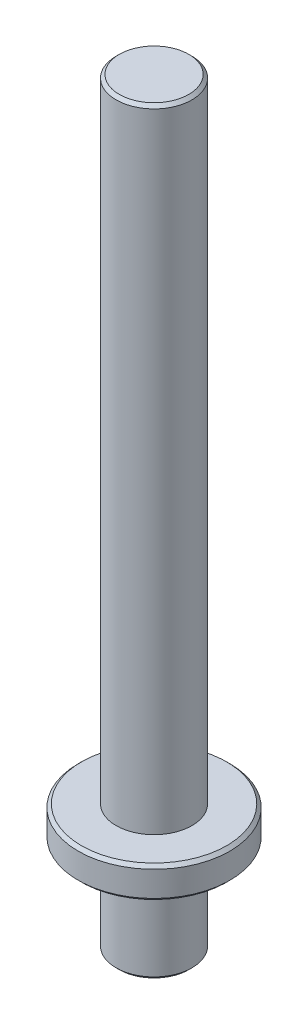
ISO-10303-21;
HEADER;
FILE_DESCRIPTION(('STEP AP214'),'2;1');
FILE_NAME('part.step','',(''),(''),'','','');
FILE_SCHEMA(('AUTOMOTIVE_DESIGN { 1 0 10303 214 1 1 1 1 }'));
ENDSEC;
DATA;
#1=APPLICATION_CONTEXT('core data for automotive mechanical design processes');
#2=APPLICATION_PROTOCOL_DEFINITION('international standard','automotive_design',2000,#1);
#3=PRODUCT_CONTEXT('',#1,'mechanical');
#4=PRODUCT('Part','Part','',(#3));
#5=PRODUCT_RELATED_PRODUCT_CATEGORY('part','',(#4));
#6=PRODUCT_DEFINITION_FORMATION('','',#4);
#7=PRODUCT_DEFINITION_CONTEXT('part definition',#1,'design');
#8=PRODUCT_DEFINITION('design','',#6,#7);
#9=PRODUCT_DEFINITION_SHAPE('','',#8);
#10=(LENGTH_UNIT() NAMED_UNIT(*) SI_UNIT(.MILLI.,.METRE.));
#11=(NAMED_UNIT(*) PLANE_ANGLE_UNIT() SI_UNIT($,.RADIAN.));
#12=(NAMED_UNIT(*) SI_UNIT($,.STERADIAN.) SOLID_ANGLE_UNIT());
#13=UNCERTAINTY_MEASURE_WITH_UNIT(LENGTH_MEASURE(1.E-05),#10,'distance_accuracy_value','');
#14=(GEOMETRIC_REPRESENTATION_CONTEXT(3) GLOBAL_UNCERTAINTY_ASSIGNED_CONTEXT((#13)) GLOBAL_UNIT_ASSIGNED_CONTEXT((#10,
#11,#12)) REPRESENTATION_CONTEXT('',''));
#15=CARTESIAN_POINT('',(0.,0.,0.));
#16=DIRECTION('',(0.,0.,1.));
#17=DIRECTION('',(1.,0.,0.));
#18=AXIS2_PLACEMENT_3D('',#15,#16,#17);
#19=CARTESIAN_POINT('',(0.,120.,0.));
#20=DIRECTION('',(0.,-1.,0.));
#21=DIRECTION('',(0.,0.,-1.));
#22=AXIS2_PLACEMENT_3D('',#19,#20,#21);
#23=CYLINDRICAL_SURFACE('',#22,6.);
#24=CARTESIAN_POINT('',(0.,119.5,0.));
#25=DIRECTION('',(0.,1.,0.));
#26=DIRECTION('',(0.,0.,1.));
#27=AXIS2_PLACEMENT_3D('',#24,#25,#26);
#28=CIRCLE('',#27,6.);
#29=CARTESIAN_POINT('',(0.,119.5,6.));
#30=VERTEX_POINT('',#29);
#31=EDGE_CURVE('E10',#30,#30,#28,.F.);
#32=ORIENTED_EDGE('',*,*,#31,.T.);
#33=EDGE_LOOP('',(#32));
#34=FACE_BOUND('',#33,.T.);
#35=CARTESIAN_POINT('',(0.,20.,0.));
#36=DIRECTION('',(0.,1.,0.));
#37=DIRECTION('',(0.,0.,1.));
#38=AXIS2_PLACEMENT_3D('',#35,#36,#37);
#39=CIRCLE('',#38,6.);
#40=CARTESIAN_POINT('',(0.,20.,6.));
#41=VERTEX_POINT('',#40);
#42=EDGE_CURVE('E72',#41,#41,#39,.T.);
#43=ORIENTED_EDGE('',*,*,#42,.T.);
#44=EDGE_LOOP('',(#43));
#45=FACE_BOUND('',#44,.T.);
#46=ADVANCED_FACE('F39',(#34,#45),#23,.T.);
#47=CARTESIAN_POINT('',(0.,120.,0.));
#48=DIRECTION('',(0.,1.,0.));
#49=DIRECTION('',(0.,0.,1.));
#50=AXIS2_PLACEMENT_3D('',#47,#48,#49);
#51=PLANE('',#50);
#52=CARTESIAN_POINT('',(0.,120.,0.));
#53=DIRECTION('',(0.,1.,0.));
#54=DIRECTION('',(0.,0.,1.));
#55=AXIS2_PLACEMENT_3D('',#52,#53,#54);
#56=CIRCLE('',#55,5.50000000000002);
#57=CARTESIAN_POINT('',(0.,120.,5.50000000000002));
#58=VERTEX_POINT('',#57);
#59=EDGE_CURVE('E47',#58,#58,#56,.T.);
#60=ORIENTED_EDGE('',*,*,#59,.T.);
#61=EDGE_LOOP('',(#60));
#62=FACE_BOUND('',#61,.T.);
#63=ADVANCED_FACE('F97',(#62),#51,.T.);
#64=CARTESIAN_POINT('',(0.,20.,0.));
#65=DIRECTION('',(0.,1.,0.));
#66=DIRECTION('',(0.,0.,1.));
#67=AXIS2_PLACEMENT_3D('',#64,#65,#66);
#68=PLANE('',#67);
#69=CARTESIAN_POINT('',(0.,20.,0.));
#70=DIRECTION('',(0.,1.,0.));
#71=DIRECTION('',(0.,0.,1.));
#72=AXIS2_PLACEMENT_3D('',#69,#70,#71);
#73=CIRCLE('',#72,11.5);
#74=CARTESIAN_POINT('',(0.,20.,11.5));
#75=VERTEX_POINT('',#74);
#76=EDGE_CURVE('E51',#75,#75,#73,.T.);
#77=ORIENTED_EDGE('',*,*,#76,.T.);
#78=EDGE_LOOP('',(#77));
#79=FACE_BOUND('',#78,.T.);
#80=ORIENTED_EDGE('',*,*,#42,.F.);
#81=EDGE_LOOP('',(#80));
#82=FACE_BOUND('',#81,.T.);
#83=ADVANCED_FACE('F93',(#79,#82),#68,.T.);
#84=CARTESIAN_POINT('',(0.,0.,0.));
#85=DIRECTION('',(0.,-1.,0.));
#86=DIRECTION('',(0.,0.,-1.));
#87=AXIS2_PLACEMENT_3D('',#84,#85,#86);
#88=CYLINDRICAL_SURFACE('',#87,12.);
#89=CARTESIAN_POINT('',(0.,15.5,0.));
#90=DIRECTION('',(0.,-1.,0.));
#91=DIRECTION('',(0.,0.,-1.));
#92=AXIS2_PLACEMENT_3D('',#89,#90,#91);
#93=CIRCLE('',#92,12.);
#94=CARTESIAN_POINT('',(0.,15.5,-12.));
#95=VERTEX_POINT('',#94);
#96=EDGE_CURVE('E55',#95,#95,#93,.F.);
#97=ORIENTED_EDGE('',*,*,#96,.T.);
#98=EDGE_LOOP('',(#97));
#99=FACE_BOUND('',#98,.T.);
#100=CARTESIAN_POINT('',(0.,19.5,0.));
#101=DIRECTION('',(0.,1.,0.));
#102=DIRECTION('',(0.,0.,1.));
#103=AXIS2_PLACEMENT_3D('',#100,#101,#102);
#104=CIRCLE('',#103,12.);
#105=CARTESIAN_POINT('',(0.,19.5,12.));
#106=VERTEX_POINT('',#105);
#107=EDGE_CURVE('E60',#106,#106,#104,.F.);
#108=ORIENTED_EDGE('',*,*,#107,.T.);
#109=EDGE_LOOP('',(#108));
#110=FACE_BOUND('',#109,.T.);
#111=ADVANCED_FACE('F84',(#99,#110),#88,.T.);
#112=CARTESIAN_POINT('',(0.,15.,-12.));
#113=DIRECTION('',(0.,-1.,0.));
#114=DIRECTION('',(0.,0.,-1.));
#115=AXIS2_PLACEMENT_3D('',#112,#113,#114);
#116=PLANE('',#115);
#117=CARTESIAN_POINT('',(0.,15.,0.));
#118=DIRECTION('',(0.,-1.,0.));
#119=DIRECTION('',(0.,0.,-1.));
#120=AXIS2_PLACEMENT_3D('',#117,#118,#119);
#121=CIRCLE('',#120,11.5);
#122=CARTESIAN_POINT('',(0.,15.,-11.5));
#123=VERTEX_POINT('',#122);
#124=EDGE_CURVE('E63',#123,#123,#121,.T.);
#125=ORIENTED_EDGE('',*,*,#124,.T.);
#126=EDGE_LOOP('',(#125));
#127=FACE_BOUND('',#126,.T.);
#128=CARTESIAN_POINT('',(0.,15.,0.));
#129=DIRECTION('',(0.,-1.,0.));
#130=DIRECTION('',(0.,0.,-1.));
#131=AXIS2_PLACEMENT_3D('',#128,#129,#130);
#132=CIRCLE('',#131,6.);
#133=CARTESIAN_POINT('',(0.,15.,-6.));
#134=VERTEX_POINT('',#133);
#135=EDGE_CURVE('E75',#134,#134,#132,.T.);
#136=ORIENTED_EDGE('',*,*,#135,.F.);
#137=EDGE_LOOP('',(#136));
#138=FACE_BOUND('',#137,.T.);
#139=ADVANCED_FACE('F81',(#127,#138),#116,.T.);
#140=CARTESIAN_POINT('',(0.,0.,0.));
#141=DIRECTION('',(0.,1.,0.));
#142=DIRECTION('',(0.,0.,1.));
#143=AXIS2_PLACEMENT_3D('',#140,#141,#142);
#144=PLANE('',#143);
#145=CARTESIAN_POINT('',(0.,0.,0.));
#146=DIRECTION('',(0.,1.,0.));
#147=DIRECTION('',(0.,0.,1.));
#148=AXIS2_PLACEMENT_3D('',#145,#146,#147);
#149=CIRCLE('',#148,5.49999999999999);
#150=CARTESIAN_POINT('',(0.,0.,5.49999999999999));
#151=VERTEX_POINT('',#150);
#152=EDGE_CURVE('E66',#151,#151,#149,.F.);
#153=ORIENTED_EDGE('',*,*,#152,.T.);
#154=EDGE_LOOP('',(#153));
#155=FACE_BOUND('',#154,.T.);
#156=ADVANCED_FACE('F83',(#155),#144,.F.);
#157=CARTESIAN_POINT('',(0.,0.5,0.));
#158=DIRECTION('',(0.,1.,0.));
#159=DIRECTION('',(0.,0.,1.));
#160=AXIS2_PLACEMENT_3D('',#157,#158,#159);
#161=CIRCLE('',#160,6.);
#162=CARTESIAN_POINT('',(0.,0.5,6.));
#163=VERTEX_POINT('',#162);
#164=EDGE_CURVE('E69',#163,#163,#161,.T.);
#165=ORIENTED_EDGE('',*,*,#164,.T.);
#166=EDGE_LOOP('',(#165));
#167=FACE_BOUND('',#166,.T.);
#168=ORIENTED_EDGE('',*,*,#135,.T.);
#169=EDGE_LOOP('',(#168));
#170=FACE_BOUND('',#169,.T.);
#171=ADVANCED_FACE('F79',(#167,#170),#23,.T.);
#172=CARTESIAN_POINT('',(0.,0.5,0.));
#173=DIRECTION('',(0.,1.,0.));
#174=DIRECTION('',(0.,0.,1.));
#175=AXIS2_PLACEMENT_3D('',#172,#173,#174);
#176=CONICAL_SURFACE('',#175,6.,0.785398163397457);
#177=ORIENTED_EDGE('',*,*,#152,.F.);
#178=EDGE_LOOP('',(#177));
#179=FACE_BOUND('',#178,.T.);
#180=ORIENTED_EDGE('',*,*,#164,.F.);
#181=EDGE_LOOP('',(#180));
#182=FACE_BOUND('',#181,.T.);
#183=ADVANCED_FACE('F106',(#179,#182),#176,.T.);
#184=CARTESIAN_POINT('',(0.,15.,0.));
#185=DIRECTION('',(0.,1.,0.));
#186=DIRECTION('',(0.,0.,1.));
#187=AXIS2_PLACEMENT_3D('',#184,#185,#186);
#188=CONICAL_SURFACE('',#187,11.5,0.785398163397434);
#189=ORIENTED_EDGE('',*,*,#96,.F.);
#190=EDGE_LOOP('',(#189));
#191=FACE_BOUND('',#190,.T.);
#192=ORIENTED_EDGE('',*,*,#124,.F.);
#193=EDGE_LOOP('',(#192));
#194=FACE_BOUND('',#193,.T.);
#195=ADVANCED_FACE('F111',(#191,#194),#188,.T.);
#196=CARTESIAN_POINT('',(0.,19.5,0.));
#197=DIRECTION('',(0.,-1.,0.));
#198=DIRECTION('',(0.,0.,-1.));
#199=AXIS2_PLACEMENT_3D('',#196,#197,#198);
#200=CONICAL_SURFACE('',#199,12.,0.785398163397459);
#201=ORIENTED_EDGE('',*,*,#76,.F.);
#202=EDGE_LOOP('',(#201));
#203=FACE_BOUND('',#202,.T.);
#204=ORIENTED_EDGE('',*,*,#107,.F.);
#205=EDGE_LOOP('',(#204));
#206=FACE_BOUND('',#205,.T.);
#207=ADVANCED_FACE('F118',(#203,#206),#200,.T.);
#208=CARTESIAN_POINT('',(0.,120.,0.));
#209=DIRECTION('',(0.,-1.,0.));
#210=DIRECTION('',(0.,0.,-1.));
#211=AXIS2_PLACEMENT_3D('',#208,#209,#210);
#212=CONICAL_SURFACE('',#211,5.50000000000002,0.78539816339743);
#213=ORIENTED_EDGE('',*,*,#31,.F.);
#214=EDGE_LOOP('',(#213));
#215=FACE_BOUND('',#214,.T.);
#216=ORIENTED_EDGE('',*,*,#59,.F.);
#217=EDGE_LOOP('',(#216));
#218=FACE_BOUND('',#217,.T.);
#219=ADVANCED_FACE('F42',(#215,#218),#212,.T.);
#220=CLOSED_SHELL('',(#46,#63,#83,#111,#139,#156,#171,#183,#195,#207,#219));
#221=MANIFOLD_SOLID_BREP('B2',#220);
#222=ADVANCED_BREP_SHAPE_REPRESENTATION('',(#18,#221),#14);
#223=SHAPE_DEFINITION_REPRESENTATION(#9,#222);
ENDSEC;
END-ISO-10303-21;
